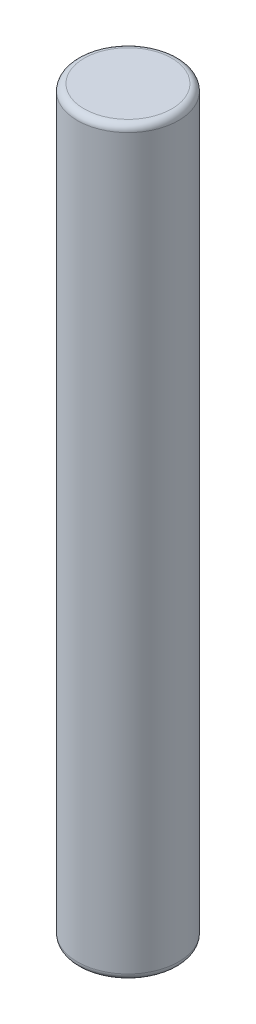
ISO-10303-21;
HEADER;
FILE_DESCRIPTION(('STEP AP214'),'2;1');
FILE_NAME('part.step','',(''),(''),'','','');
FILE_SCHEMA(('AUTOMOTIVE_DESIGN { 1 0 10303 214 1 1 1 1 }'));
ENDSEC;
DATA;
#1=APPLICATION_CONTEXT('core data for automotive mechanical design processes');
#2=APPLICATION_PROTOCOL_DEFINITION('international standard','automotive_design',2000,#1);
#3=PRODUCT_CONTEXT('',#1,'mechanical');
#4=PRODUCT('Part','Part','',(#3));
#5=PRODUCT_RELATED_PRODUCT_CATEGORY('part','',(#4));
#6=PRODUCT_DEFINITION_FORMATION('','',#4);
#7=PRODUCT_DEFINITION_CONTEXT('part definition',#1,'design');
#8=PRODUCT_DEFINITION('design','',#6,#7);
#9=PRODUCT_DEFINITION_SHAPE('','',#8);
#10=(LENGTH_UNIT() NAMED_UNIT(*) SI_UNIT(.MILLI.,.METRE.));
#11=(NAMED_UNIT(*) PLANE_ANGLE_UNIT() SI_UNIT($,.RADIAN.));
#12=(NAMED_UNIT(*) SI_UNIT($,.STERADIAN.) SOLID_ANGLE_UNIT());
#13=UNCERTAINTY_MEASURE_WITH_UNIT(LENGTH_MEASURE(1.E-05),#10,'distance_accuracy_value','');
#14=(GEOMETRIC_REPRESENTATION_CONTEXT(3) GLOBAL_UNCERTAINTY_ASSIGNED_CONTEXT((#13)) GLOBAL_UNIT_ASSIGNED_CONTEXT((#10,
#11,#12)) REPRESENTATION_CONTEXT('',''));
#15=CARTESIAN_POINT('',(0.,0.,0.));
#16=DIRECTION('',(0.,0.,1.));
#17=DIRECTION('',(1.,0.,0.));
#18=AXIS2_PLACEMENT_3D('',#15,#16,#17);
#19=CARTESIAN_POINT('',(0.,110.,0.));
#20=DIRECTION('',(0.,-1.,0.));
#21=DIRECTION('',(0.,0.,-1.));
#22=AXIS2_PLACEMENT_3D('',#19,#20,#21);
#23=CYLINDRICAL_SURFACE('',#22,15.);
#24=CARTESIAN_POINT('',(0.,-108.,0.));
#25=DIRECTION('',(0.,1.,0.));
#26=DIRECTION('',(0.,0.,1.));
#27=AXIS2_PLACEMENT_3D('',#24,#25,#26);
#28=CIRCLE('',#27,15.);
#29=CARTESIAN_POINT('',(0.,-108.,15.));
#30=VERTEX_POINT('',#29);
#31=EDGE_CURVE('E46',#30,#30,#28,.T.);
#32=ORIENTED_EDGE('',*,*,#31,.T.);
#33=EDGE_LOOP('',(#32));
#34=FACE_BOUND('',#33,.T.);
#35=CARTESIAN_POINT('',(0.,108.,0.));
#36=DIRECTION('',(0.,1.,0.));
#37=DIRECTION('',(0.,0.,1.));
#38=AXIS2_PLACEMENT_3D('',#35,#36,#37);
#39=CIRCLE('',#38,15.);
#40=CARTESIAN_POINT('',(0.,108.,15.));
#41=VERTEX_POINT('',#40);
#42=EDGE_CURVE('E50',#41,#41,#39,.F.);
#43=ORIENTED_EDGE('',*,*,#42,.T.);
#44=EDGE_LOOP('',(#43));
#45=FACE_BOUND('',#44,.T.);
#46=ADVANCED_FACE('F35',(#34,#45),#23,.T.);
#47=CARTESIAN_POINT('',(0.,110.,0.));
#48=DIRECTION('',(0.,1.,0.));
#49=DIRECTION('',(0.,0.,1.));
#50=AXIS2_PLACEMENT_3D('',#47,#48,#49);
#51=PLANE('',#50);
#52=CARTESIAN_POINT('',(0.,110.,0.));
#53=DIRECTION('',(0.,1.,0.));
#54=DIRECTION('',(0.,0.,1.));
#55=AXIS2_PLACEMENT_3D('',#52,#53,#54);
#56=CIRCLE('',#55,13.);
#57=CARTESIAN_POINT('',(0.,110.,13.));
#58=VERTEX_POINT('',#57);
#59=EDGE_CURVE('E10',#58,#58,#56,.T.);
#60=ORIENTED_EDGE('',*,*,#59,.T.);
#61=EDGE_LOOP('',(#60));
#62=FACE_BOUND('',#61,.T.);
#63=ADVANCED_FACE('F66',(#62),#51,.T.);
#64=CARTESIAN_POINT('',(0.,-110.,0.));
#65=DIRECTION('',(0.,1.,0.));
#66=DIRECTION('',(0.,0.,1.));
#67=AXIS2_PLACEMENT_3D('',#64,#65,#66);
#68=PLANE('',#67);
#69=CARTESIAN_POINT('',(0.,-110.,0.));
#70=DIRECTION('',(0.,1.,0.));
#71=DIRECTION('',(0.,0.,1.));
#72=AXIS2_PLACEMENT_3D('',#69,#70,#71);
#73=CIRCLE('',#72,13.);
#74=CARTESIAN_POINT('',(0.,-110.,13.));
#75=VERTEX_POINT('',#74);
#76=EDGE_CURVE('E42',#75,#75,#73,.F.);
#77=ORIENTED_EDGE('',*,*,#76,.T.);
#78=EDGE_LOOP('',(#77));
#79=FACE_BOUND('',#78,.T.);
#80=ADVANCED_FACE('F63',(#79),#68,.F.);
#81=CARTESIAN_POINT('',(0.,-108.,0.));
#82=DIRECTION('',(0.,1.,0.));
#83=DIRECTION('',(0.,0.,1.));
#84=AXIS2_PLACEMENT_3D('',#81,#82,#83);
#85=TOROIDAL_SURFACE('',#84,13.,2.);
#86=ORIENTED_EDGE('',*,*,#76,.F.);
#87=EDGE_LOOP('',(#86));
#88=FACE_BOUND('',#87,.T.);
#89=ORIENTED_EDGE('',*,*,#31,.F.);
#90=EDGE_LOOP('',(#89));
#91=FACE_BOUND('',#90,.T.);
#92=ADVANCED_FACE('F59',(#88,#91),#85,.T.);
#93=CARTESIAN_POINT('',(0.,108.,0.));
#94=DIRECTION('',(0.,1.,0.));
#95=DIRECTION('',(0.,0.,1.));
#96=AXIS2_PLACEMENT_3D('',#93,#94,#95);
#97=TOROIDAL_SURFACE('',#96,13.,2.);
#98=ORIENTED_EDGE('',*,*,#42,.F.);
#99=EDGE_LOOP('',(#98));
#100=FACE_BOUND('',#99,.T.);
#101=ORIENTED_EDGE('',*,*,#59,.F.);
#102=EDGE_LOOP('',(#101));
#103=FACE_BOUND('',#102,.T.);
#104=ADVANCED_FACE('F37',(#100,#103),#97,.T.);
#105=CLOSED_SHELL('',(#46,#63,#80,#92,#104));
#106=MANIFOLD_SOLID_BREP('B2',#105);
#107=ADVANCED_BREP_SHAPE_REPRESENTATION('',(#18,#106),#14);
#108=SHAPE_DEFINITION_REPRESENTATION(#9,#107);
ENDSEC;
END-ISO-10303-21;
